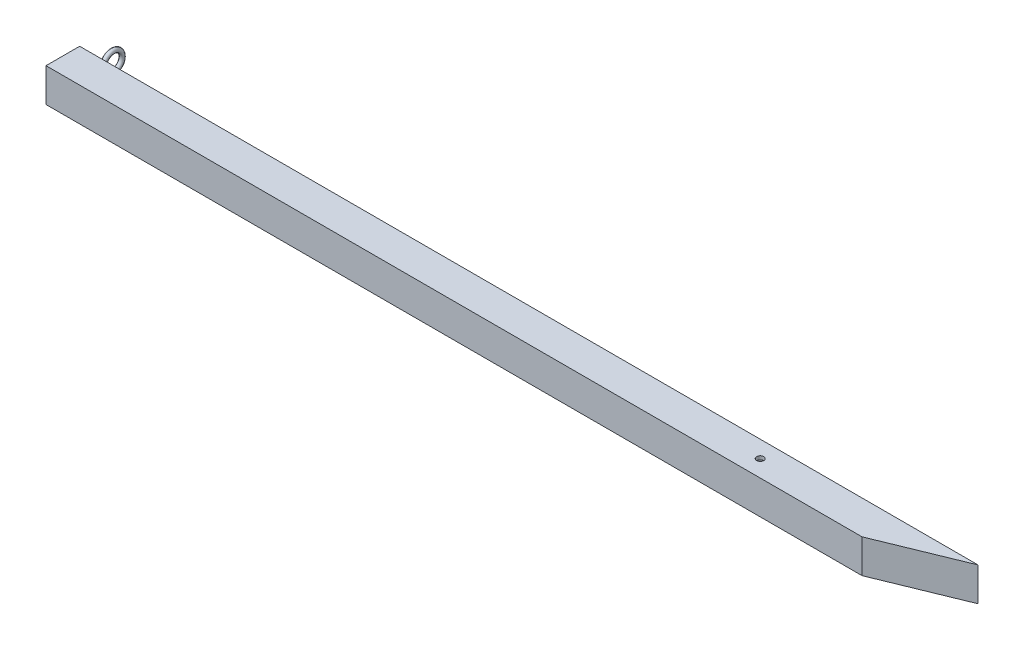
ISO-10303-21;
HEADER;
FILE_DESCRIPTION(('STEP AP214'),'2;1');
FILE_NAME('part.step','',(''),(''),'','','');
FILE_SCHEMA(('AUTOMOTIVE_DESIGN { 1 0 10303 214 1 1 1 1 }'));
ENDSEC;
DATA;
#1=APPLICATION_CONTEXT('core data for automotive mechanical design processes');
#2=APPLICATION_PROTOCOL_DEFINITION('international standard','automotive_design',2000,#1);
#3=PRODUCT_CONTEXT('',#1,'mechanical');
#4=PRODUCT('Part','Part','',(#3));
#5=PRODUCT_RELATED_PRODUCT_CATEGORY('part','',(#4));
#6=PRODUCT_DEFINITION_FORMATION('','',#4);
#7=PRODUCT_DEFINITION_CONTEXT('part definition',#1,'design');
#8=PRODUCT_DEFINITION('design','',#6,#7);
#9=PRODUCT_DEFINITION_SHAPE('','',#8);
#10=(LENGTH_UNIT() NAMED_UNIT(*) SI_UNIT(.MILLI.,.METRE.));
#11=(NAMED_UNIT(*) PLANE_ANGLE_UNIT() SI_UNIT($,.RADIAN.));
#12=(NAMED_UNIT(*) SI_UNIT($,.STERADIAN.) SOLID_ANGLE_UNIT());
#13=UNCERTAINTY_MEASURE_WITH_UNIT(LENGTH_MEASURE(1.E-05),#10,'distance_accuracy_value','');
#14=(GEOMETRIC_REPRESENTATION_CONTEXT(3) GLOBAL_UNCERTAINTY_ASSIGNED_CONTEXT((#13)) GLOBAL_UNIT_ASSIGNED_CONTEXT((#10,
#11,#12)) REPRESENTATION_CONTEXT('',''));
#15=CARTESIAN_POINT('',(0.,0.,0.));
#16=DIRECTION('',(0.,0.,1.));
#17=DIRECTION('',(1.,0.,0.));
#18=AXIS2_PLACEMENT_3D('',#15,#16,#17);
#19=CARTESIAN_POINT('',(0.,19.,19.));
#20=DIRECTION('',(0.,0.,-1.));
#21=DIRECTION('',(0.,1.,0.));
#22=AXIS2_PLACEMENT_3D('',#19,#20,#21);
#23=PLANE('',#22);
#24=DIRECTION('',(0.,-1.,0.));
#25=VECTOR('',#24,1.);
#26=CARTESIAN_POINT('',(-1000.,19.,19.0000000000001));
#27=LINE('',#26,#25);
#28=CARTESIAN_POINT('',(-1000.,19.,19.0000000000001));
#29=VERTEX_POINT('',#28);
#30=CARTESIAN_POINT('',(-1000.,-19.,19.0000000000001));
#31=VERTEX_POINT('',#30);
#32=EDGE_CURVE('E213',#29,#31,#27,.T.);
#33=ORIENTED_EDGE('',*,*,#32,.T.);
#34=DIRECTION('',(-1.,0.,0.));
#35=VECTOR('',#34,1.);
#36=CARTESIAN_POINT('',(0.,-19.,19.));
#37=LINE('',#36,#35);
#38=CARTESIAN_POINT('',(-78.672157524254,-19.,19.));
#39=VERTEX_POINT('',#38);
#40=EDGE_CURVE('E217',#39,#31,#37,.T.);
#41=ORIENTED_EDGE('',*,*,#40,.F.);
#42=DIRECTION('',(0.,1.,0.));
#43=VECTOR('',#42,1.);
#44=CARTESIAN_POINT('',(-78.672157524254,-19.,19.));
#45=LINE('',#44,#43);
#46=CARTESIAN_POINT('',(-78.672157524254,19.,19.));
#47=VERTEX_POINT('',#46);
#48=EDGE_CURVE('E157',#39,#47,#45,.T.);
#49=ORIENTED_EDGE('',*,*,#48,.T.);
#50=DIRECTION('',(-1.,0.,0.));
#51=VECTOR('',#50,1.);
#52=CARTESIAN_POINT('',(0.,19.,19.));
#53=LINE('',#52,#51);
#54=EDGE_CURVE('E196',#47,#29,#53,.T.);
#55=ORIENTED_EDGE('',*,*,#54,.T.);
#56=EDGE_LOOP('',(#33,#41,#49,#55));
#57=FACE_BOUND('',#56,.T.);
#58=ADVANCED_FACE('F58',(#57),#23,.F.);
#59=CARTESIAN_POINT('',(0.,-19.,-19.));
#60=DIRECTION('',(0.,1.,0.));
#61=DIRECTION('',(0.,0.,1.));
#62=AXIS2_PLACEMENT_3D('',#59,#60,#61);
#63=PLANE('',#62);
#64=CARTESIAN_POINT('',(-212.63683242,-19.,0.));
#65=DIRECTION('',(0.,1.,0.));
#66=DIRECTION('',(0.,0.,1.));
#67=AXIS2_PLACEMENT_3D('',#64,#65,#66);
#68=CIRCLE('',#67,3.99999999999999);
#69=CARTESIAN_POINT('',(-212.63683242,-19.,4.00000000000002));
#70=VERTEX_POINT('',#69);
#71=EDGE_CURVE('E180',#70,#70,#68,.T.);
#72=ORIENTED_EDGE('',*,*,#71,.T.);
#73=EDGE_LOOP('',(#72));
#74=FACE_BOUND('',#73,.T.);
#75=DIRECTION('',(0.,0.,-1.));
#76=VECTOR('',#75,1.);
#77=CARTESIAN_POINT('',(-1000.,-19.,-18.9999999999999));
#78=LINE('',#77,#76);
#79=CARTESIAN_POINT('',(-1000.,-19.,-18.9999999999999));
#80=VERTEX_POINT('',#79);
#81=EDGE_CURVE('E220',#31,#80,#78,.T.);
#82=ORIENTED_EDGE('',*,*,#81,.T.);
#83=DIRECTION('',(-1.,0.,0.));
#84=VECTOR('',#83,1.);
#85=CARTESIAN_POINT('',(0.,-19.,-19.));
#86=LINE('',#85,#84);
#87=CARTESIAN_POINT('',(14.258492684254,-19.,-19.));
#88=VERTEX_POINT('',#87);
#89=EDGE_CURVE('E226',#88,#80,#86,.T.);
#90=ORIENTED_EDGE('',*,*,#89,.F.);
#91=DIRECTION('',(-0.925606576571254,0.,0.378487074294542));
#92=VECTOR('',#91,1.);
#93=CARTESIAN_POINT('',(-78.672157524254,-19.,19.));
#94=LINE('',#93,#92);
#95=EDGE_CURVE('E150',#88,#39,#94,.T.);
#96=ORIENTED_EDGE('',*,*,#95,.T.);
#97=ORIENTED_EDGE('',*,*,#40,.T.);
#98=EDGE_LOOP('',(#82,#90,#96,#97));
#99=FACE_BOUND('',#98,.T.);
#100=ADVANCED_FACE('F256',(#74,#99),#63,.F.);
#101=CARTESIAN_POINT('',(0.,19.,-19.));
#102=DIRECTION('',(0.,0.,1.));
#103=DIRECTION('',(0.,-1.,0.));
#104=AXIS2_PLACEMENT_3D('',#101,#102,#103);
#105=PLANE('',#104);
#106=CARTESIAN_POINT('',(-985.,0.,-19.));
#107=DIRECTION('',(0.,0.,1.));
#108=DIRECTION('',(0.,-1.,0.));
#109=AXIS2_PLACEMENT_3D('',#106,#107,#108);
#110=CIRCLE('',#109,2.49999999999995);
#111=CARTESIAN_POINT('',(-985.,-2.49999999999996,-19.));
#112=VERTEX_POINT('',#111);
#113=EDGE_CURVE('E161',#112,#112,#110,.T.);
#114=ORIENTED_EDGE('',*,*,#113,.T.);
#115=EDGE_LOOP('',(#114));
#116=FACE_BOUND('',#115,.T.);
#117=DIRECTION('',(0.,1.,0.));
#118=VECTOR('',#117,1.);
#119=CARTESIAN_POINT('',(-1000.,19.,-18.9999999999999));
#120=LINE('',#119,#118);
#121=CARTESIAN_POINT('',(-1000.,19.,-18.9999999999999));
#122=VERTEX_POINT('',#121);
#123=EDGE_CURVE('E229',#80,#122,#120,.T.);
#124=ORIENTED_EDGE('',*,*,#123,.T.);
#125=DIRECTION('',(-1.,0.,0.));
#126=VECTOR('',#125,1.);
#127=CARTESIAN_POINT('',(0.,19.,-19.));
#128=LINE('',#127,#126);
#129=CARTESIAN_POINT('',(14.258492684254,19.,-19.));
#130=VERTEX_POINT('',#129);
#131=EDGE_CURVE('E233',#130,#122,#128,.T.);
#132=ORIENTED_EDGE('',*,*,#131,.F.);
#133=DIRECTION('',(0.,1.,0.));
#134=VECTOR('',#133,1.);
#135=CARTESIAN_POINT('',(14.258492684254,-19.,-19.));
#136=LINE('',#135,#134);
#137=EDGE_CURVE('E154',#88,#130,#136,.T.);
#138=ORIENTED_EDGE('',*,*,#137,.F.);
#139=ORIENTED_EDGE('',*,*,#89,.T.);
#140=EDGE_LOOP('',(#124,#132,#138,#139));
#141=FACE_BOUND('',#140,.T.);
#142=ADVANCED_FACE('F263',(#116,#141),#105,.F.);
#143=CARTESIAN_POINT('',(0.,19.,-19.));
#144=DIRECTION('',(0.,-1.,0.));
#145=DIRECTION('',(0.,0.,-1.));
#146=AXIS2_PLACEMENT_3D('',#143,#144,#145);
#147=PLANE('',#146);
#148=CARTESIAN_POINT('',(-212.63683242,19.,0.));
#149=DIRECTION('',(0.,1.,0.));
#150=DIRECTION('',(0.,0.,1.));
#151=AXIS2_PLACEMENT_3D('',#148,#149,#150);
#152=CIRCLE('',#151,3.99999999999999);
#153=CARTESIAN_POINT('',(-212.63683242,19.,4.00000000000002));
#154=VERTEX_POINT('',#153);
#155=EDGE_CURVE('E179',#154,#154,#152,.T.);
#156=ORIENTED_EDGE('',*,*,#155,.F.);
#157=EDGE_LOOP('',(#156));
#158=FACE_BOUND('',#157,.T.);
#159=DIRECTION('',(0.,0.,1.));
#160=VECTOR('',#159,1.);
#161=CARTESIAN_POINT('',(-1000.,19.,-18.9999999999999));
#162=LINE('',#161,#160);
#163=EDGE_CURVE('E67',#122,#29,#162,.T.);
#164=ORIENTED_EDGE('',*,*,#163,.T.);
#165=ORIENTED_EDGE('',*,*,#54,.F.);
#166=DIRECTION('',(-0.925606576571254,0.,0.378487074294542));
#167=VECTOR('',#166,1.);
#168=CARTESIAN_POINT('',(-78.672157524254,19.,19.));
#169=LINE('',#168,#167);
#170=EDGE_CURVE('E142',#130,#47,#169,.T.);
#171=ORIENTED_EDGE('',*,*,#170,.F.);
#172=ORIENTED_EDGE('',*,*,#131,.T.);
#173=EDGE_LOOP('',(#164,#165,#171,#172));
#174=FACE_BOUND('',#173,.T.);
#175=ADVANCED_FACE('F269',(#158,#174),#147,.F.);
#176=CARTESIAN_POINT('',(5.0000000000001,15.,-15.));
#177=DIRECTION('',(0.,-1.,0.));
#178=DIRECTION('',(0.,0.,-1.));
#179=AXIS2_PLACEMENT_3D('',#176,#177,#178);
#180=PLANE('',#179);
#181=DIRECTION('',(0.925606576571255,0.,-0.378487074294542));
#182=VECTOR('',#181,1.);
#183=CARTESIAN_POINT('',(3.41103310534666,15.,-18.8858875442089));
#184=LINE('',#183,#182);
#185=CARTESIAN_POINT('',(-79.4583764308564,15.,15.));
#186=VERTEX_POINT('',#185);
#187=CARTESIAN_POINT('',(-6.09207363466579,15.,-15.));
#188=VERTEX_POINT('',#187);
#189=EDGE_CURVE('E136',#186,#188,#184,.T.);
#190=ORIENTED_EDGE('',*,*,#189,.F.);
#191=DIRECTION('',(-1.,0.,0.));
#192=VECTOR('',#191,1.);
#193=CARTESIAN_POINT('',(5.0000000000001,15.,15.));
#194=LINE('',#193,#192);
#195=CARTESIAN_POINT('',(-1000.,15.,15.0000000000001));
#196=VERTEX_POINT('',#195);
#197=EDGE_CURVE('E124',#186,#196,#194,.T.);
#198=ORIENTED_EDGE('',*,*,#197,.T.);
#199=DIRECTION('',(0.,0.,-1.));
#200=VECTOR('',#199,1.);
#201=CARTESIAN_POINT('',(-1000.,15.,-15.));
#202=LINE('',#201,#200);
#203=CARTESIAN_POINT('',(-1000.,15.,-14.9999999999999));
#204=VERTEX_POINT('',#203);
#205=EDGE_CURVE('E201',#196,#204,#202,.T.);
#206=ORIENTED_EDGE('',*,*,#205,.T.);
#207=DIRECTION('',(-1.,0.,0.));
#208=VECTOR('',#207,1.);
#209=CARTESIAN_POINT('',(5.0000000000001,15.,-15.));
#210=LINE('',#209,#208);
#211=EDGE_CURVE('E139',#188,#204,#210,.T.);
#212=ORIENTED_EDGE('',*,*,#211,.F.);
#213=EDGE_LOOP('',(#190,#198,#206,#212));
#214=FACE_BOUND('',#213,.T.);
#215=CARTESIAN_POINT('',(-212.63683242,15.,0.));
#216=DIRECTION('',(0.,-1.,0.));
#217=DIRECTION('',(0.,0.,-1.));
#218=AXIS2_PLACEMENT_3D('',#215,#216,#217);
#219=CIRCLE('',#218,3.99999999999999);
#220=CARTESIAN_POINT('',(-212.63683242,15.,-3.99999999999996));
#221=VERTEX_POINT('',#220);
#222=EDGE_CURVE('E188',#221,#221,#219,.T.);
#223=ORIENTED_EDGE('',*,*,#222,.F.);
#224=EDGE_LOOP('',(#223));
#225=FACE_BOUND('',#224,.T.);
#226=ADVANCED_FACE('F137',(#214,#225),#180,.T.);
#227=CARTESIAN_POINT('',(5.0000000000001,15.,-15.));
#228=DIRECTION('',(0.,0.,1.));
#229=DIRECTION('',(1.,0.,0.));
#230=AXIS2_PLACEMENT_3D('',#227,#228,#229);
#231=PLANE('',#230);
#232=DIRECTION('',(0.,-1.,0.));
#233=VECTOR('',#232,1.);
#234=CARTESIAN_POINT('',(-6.09207363466579,15.,-15.));
#235=LINE('',#234,#233);
#236=CARTESIAN_POINT('',(-6.09207363466579,-15.,-15.));
#237=VERTEX_POINT('',#236);
#238=EDGE_CURVE('E74',#188,#237,#235,.T.);
#239=ORIENTED_EDGE('',*,*,#238,.F.);
#240=ORIENTED_EDGE('',*,*,#211,.T.);
#241=DIRECTION('',(0.,-1.,0.));
#242=VECTOR('',#241,1.);
#243=CARTESIAN_POINT('',(-1000.,15.,-14.9999999999999));
#244=LINE('',#243,#242);
#245=CARTESIAN_POINT('',(-1000.,-15.,-14.9999999999999));
#246=VERTEX_POINT('',#245);
#247=EDGE_CURVE('E197',#204,#246,#244,.T.);
#248=ORIENTED_EDGE('',*,*,#247,.T.);
#249=DIRECTION('',(-1.,0.,0.));
#250=VECTOR('',#249,1.);
#251=CARTESIAN_POINT('',(5.0000000000001,-15.,-15.));
#252=LINE('',#251,#250);
#253=EDGE_CURVE('E208',#237,#246,#252,.T.);
#254=ORIENTED_EDGE('',*,*,#253,.F.);
#255=EDGE_LOOP('',(#239,#240,#248,#254));
#256=FACE_BOUND('',#255,.T.);
#257=ADVANCED_FACE('F247',(#256),#231,.T.);
#258=CARTESIAN_POINT('',(5.0000000000001,-15.,-15.));
#259=DIRECTION('',(0.,1.,0.));
#260=DIRECTION('',(0.,0.,1.));
#261=AXIS2_PLACEMENT_3D('',#258,#259,#260);
#262=PLANE('',#261);
#263=DIRECTION('',(-0.925606576571255,0.,0.378487074294542));
#264=VECTOR('',#263,1.);
#265=CARTESIAN_POINT('',(3.41103310534666,-15.,-18.8858875442089));
#266=LINE('',#265,#264);
#267=CARTESIAN_POINT('',(-79.4583764308564,-15.,15.));
#268=VERTEX_POINT('',#267);
#269=EDGE_CURVE('E82',#237,#268,#266,.T.);
#270=ORIENTED_EDGE('',*,*,#269,.F.);
#271=ORIENTED_EDGE('',*,*,#253,.T.);
#272=DIRECTION('',(0.,0.,1.));
#273=VECTOR('',#272,1.);
#274=CARTESIAN_POINT('',(-1000.,-15.,-15.));
#275=LINE('',#274,#273);
#276=CARTESIAN_POINT('',(-1000.,-15.,15.0000000000001));
#277=VERTEX_POINT('',#276);
#278=EDGE_CURVE('E192',#246,#277,#275,.T.);
#279=ORIENTED_EDGE('',*,*,#278,.T.);
#280=DIRECTION('',(-1.,0.,0.));
#281=VECTOR('',#280,1.);
#282=CARTESIAN_POINT('',(5.0000000000001,-15.,15.));
#283=LINE('',#282,#281);
#284=EDGE_CURVE('E133',#268,#277,#283,.T.);
#285=ORIENTED_EDGE('',*,*,#284,.F.);
#286=EDGE_LOOP('',(#270,#271,#279,#285));
#287=FACE_BOUND('',#286,.T.);
#288=CARTESIAN_POINT('',(-212.63683242,-15.,0.));
#289=DIRECTION('',(0.,1.,0.));
#290=DIRECTION('',(0.,0.,1.));
#291=AXIS2_PLACEMENT_3D('',#288,#289,#290);
#292=CIRCLE('',#291,3.99999999999999);
#293=CARTESIAN_POINT('',(-212.63683242,-15.,4.00000000000002));
#294=VERTEX_POINT('',#293);
#295=EDGE_CURVE('E184',#294,#294,#292,.T.);
#296=ORIENTED_EDGE('',*,*,#295,.F.);
#297=EDGE_LOOP('',(#296));
#298=FACE_BOUND('',#297,.T.);
#299=ADVANCED_FACE('F245',(#287,#298),#262,.T.);
#300=CARTESIAN_POINT('',(5.0000000000001,15.,15.));
#301=DIRECTION('',(0.,0.,-1.));
#302=DIRECTION('',(-1.,0.,0.));
#303=AXIS2_PLACEMENT_3D('',#300,#301,#302);
#304=PLANE('',#303);
#305=DIRECTION('',(0.,1.,0.));
#306=VECTOR('',#305,1.);
#307=CARTESIAN_POINT('',(-79.4583764308564,15.,15.));
#308=LINE('',#307,#306);
#309=EDGE_CURVE('E12',#268,#186,#308,.T.);
#310=ORIENTED_EDGE('',*,*,#309,.F.);
#311=ORIENTED_EDGE('',*,*,#284,.T.);
#312=DIRECTION('',(0.,1.,0.));
#313=VECTOR('',#312,1.);
#314=CARTESIAN_POINT('',(-1000.,15.,15.0000000000001));
#315=LINE('',#314,#313);
#316=EDGE_CURVE('E128',#277,#196,#315,.T.);
#317=ORIENTED_EDGE('',*,*,#316,.T.);
#318=ORIENTED_EDGE('',*,*,#197,.F.);
#319=EDGE_LOOP('',(#310,#311,#317,#318));
#320=FACE_BOUND('',#319,.T.);
#321=ADVANCED_FACE('F126',(#320),#304,.T.);
#322=CARTESIAN_POINT('',(-1000.,0.,1.22464679914735E-13));
#323=DIRECTION('',(-1.,0.,0.));
#324=DIRECTION('',(0.,0.,1.));
#325=AXIS2_PLACEMENT_3D('',#322,#323,#324);
#326=PLANE('',#325);
#327=ORIENTED_EDGE('',*,*,#32,.F.);
#328=ORIENTED_EDGE('',*,*,#163,.F.);
#329=ORIENTED_EDGE('',*,*,#123,.F.);
#330=ORIENTED_EDGE('',*,*,#81,.F.);
#331=EDGE_LOOP('',(#327,#328,#329,#330));
#332=FACE_BOUND('',#331,.T.);
#333=ORIENTED_EDGE('',*,*,#247,.F.);
#334=ORIENTED_EDGE('',*,*,#205,.F.);
#335=ORIENTED_EDGE('',*,*,#316,.F.);
#336=ORIENTED_EDGE('',*,*,#278,.F.);
#337=EDGE_LOOP('',(#333,#334,#335,#336));
#338=FACE_BOUND('',#337,.T.);
#339=ADVANCED_FACE('F60',(#332,#338),#326,.T.);
#340=CARTESIAN_POINT('',(-212.63683242,-19.,0.));
#341=DIRECTION('',(0.,1.,0.));
#342=DIRECTION('',(0.,0.,1.));
#343=AXIS2_PLACEMENT_3D('',#340,#341,#342);
#344=CYLINDRICAL_SURFACE('',#343,3.99999999999999);
#345=ORIENTED_EDGE('',*,*,#295,.T.);
#346=EDGE_LOOP('',(#345));
#347=FACE_BOUND('',#346,.T.);
#348=ORIENTED_EDGE('',*,*,#71,.F.);
#349=EDGE_LOOP('',(#348));
#350=FACE_BOUND('',#349,.T.);
#351=ADVANCED_FACE('F242',(#347,#350),#344,.F.);
#352=ORIENTED_EDGE('',*,*,#222,.T.);
#353=EDGE_LOOP('',(#352));
#354=FACE_BOUND('',#353,.T.);
#355=ORIENTED_EDGE('',*,*,#155,.T.);
#356=EDGE_LOOP('',(#355));
#357=FACE_BOUND('',#356,.T.);
#358=ADVANCED_FACE('F305',(#354,#357),#344,.F.);
#359=CARTESIAN_POINT('',(-985.,-3.16866893852641,-31.3212637978578));
#360=DIRECTION('',(0.,-0.950063394598164,-0.312056959936186));
#361=DIRECTION('',(0.,0.312056959936186,-0.950063394598164));
#362=AXIS2_PLACEMENT_3D('',#359,#360,#361);
#363=PLANE('',#362);
#364=CARTESIAN_POINT('',(-985.,-3.16866893852641,-31.3212637978578));
#365=DIRECTION('',(0.,-0.950063394598164,-0.312056959936186));
#366=DIRECTION('',(0.,0.312056959936186,-0.950063394598164));
#367=AXIS2_PLACEMENT_3D('',#364,#365,#366);
#368=CIRCLE('',#367,2.49999999999995);
#369=CARTESIAN_POINT('',(-985.,-2.38852653868596,-33.6964222843532));
#370=VERTEX_POINT('',#369);
#371=EDGE_CURVE('E175',#370,#370,#368,.T.);
#372=ORIENTED_EDGE('',*,*,#371,.F.);
#373=EDGE_LOOP('',(#372));
#374=FACE_BOUND('',#373,.T.);
#375=ADVANCED_FACE('F297',(#374),#363,.F.);
#376=CARTESIAN_POINT('',(-985.,0.,-19.));
#377=DIRECTION('',(0.,0.,-1.));
#378=DIRECTION('',(0.,1.,0.));
#379=AXIS2_PLACEMENT_3D('',#376,#377,#378);
#380=CYLINDRICAL_SURFACE('',#379,2.49999999999995);
#381=CARTESIAN_POINT('',(-985.,0.,-26.570946824867));
#382=DIRECTION('',(0.,0.,1.));
#383=DIRECTION('',(0.,-1.,0.));
#384=AXIS2_PLACEMENT_3D('',#381,#382,#383);
#385=CIRCLE('',#384,2.49999999999995);
#386=CARTESIAN_POINT('',(-985.,-2.49999999999995,-26.570946824867));
#387=VERTEX_POINT('',#386);
#388=EDGE_CURVE('E167',#387,#387,#385,.T.);
#389=ORIENTED_EDGE('',*,*,#388,.T.);
#390=EDGE_LOOP('',(#389));
#391=FACE_BOUND('',#390,.T.);
#392=ORIENTED_EDGE('',*,*,#113,.F.);
#393=EDGE_LOOP('',(#392));
#394=FACE_BOUND('',#393,.T.);
#395=ADVANCED_FACE('F308',(#391,#394),#380,.T.);
#396=CARTESIAN_POINT('',(-985.,5.,-26.570946824867));
#397=DIRECTION('',(1.,0.,0.));
#398=DIRECTION('',(0.,0.,-1.));
#399=AXIS2_PLACEMENT_3D('',#396,#397,#398);
#400=TOROIDAL_SURFACE('',#399,5.,2.49999999999995);
#401=CARTESIAN_POINT('',(-985.,3.43971520031906,-31.3212637978578));
#402=DIRECTION('',(0.,-0.950063394598164,0.312056959936186));
#403=DIRECTION('',(0.,-0.312056959936186,-0.950063394598164));
#404=AXIS2_PLACEMENT_3D('',#401,#402,#403);
#405=CIRCLE('',#404,2.49999999999995);
#406=CARTESIAN_POINT('',(-985.,2.65957280047861,-33.6964222843532));
#407=VERTEX_POINT('',#406);
#408=EDGE_CURVE('E171',#407,#407,#405,.T.);
#409=CARTESIAN_POINT('',(-985.,5.,-26.570946824867));
#410=DIRECTION('',(1.,0.,0.));
#411=DIRECTION('',(0.,0.,-1.));
#412=AXIS2_PLACEMENT_3D('',#409,#410,#411);
#413=CIRCLE('',#412,7.49999999999995);
#414=EDGE_CURVE('',#387,#407,#413,.T.);
#415=ORIENTED_EDGE('',*,*,#388,.F.);
#416=ORIENTED_EDGE('',*,*,#408,.T.);
#417=ORIENTED_EDGE('',*,*,#414,.T.);
#418=ORIENTED_EDGE('',*,*,#414,.F.);
#419=EDGE_LOOP('',(#415,#417,#416,#418));
#420=FACE_BOUND('',#419,.T.);
#421=ADVANCED_FACE('F302',(#420),#400,.T.);
#422=CARTESIAN_POINT('',(-985.,0.13552313089633,-41.3809398727707));
#423=DIRECTION('',(-1.,0.,0.));
#424=DIRECTION('',(0.,0.,1.));
#425=AXIS2_PLACEMENT_3D('',#422,#423,#424);
#426=TOROIDAL_SURFACE('',#425,10.588426132519,2.49999999999995);
#427=ORIENTED_EDGE('',*,*,#371,.T.);
#428=EDGE_LOOP('',(#427));
#429=FACE_BOUND('',#428,.T.);
#430=ORIENTED_EDGE('',*,*,#408,.F.);
#431=EDGE_LOOP('',(#430));
#432=FACE_BOUND('',#431,.T.);
#433=ADVANCED_FACE('F295',(#429,#432),#426,.T.);
#434=CARTESIAN_POINT('',(-78.672157524254,-19.,19.));
#435=DIRECTION('',(-0.378487074294542,0.,-0.925606576571254));
#436=DIRECTION('',(-0.925606576571255,0.,0.378487074294542));
#437=AXIS2_PLACEMENT_3D('',#434,#435,#436);
#438=PLANE('',#437);
#439=ORIENTED_EDGE('',*,*,#170,.T.);
#440=ORIENTED_EDGE('',*,*,#48,.F.);
#441=ORIENTED_EDGE('',*,*,#95,.F.);
#442=ORIENTED_EDGE('',*,*,#137,.T.);
#443=EDGE_LOOP('',(#439,#440,#441,#442));
#444=FACE_BOUND('',#443,.T.);
#445=ADVANCED_FACE('F289',(#444),#438,.F.);
#446=CARTESIAN_POINT('',(3.6901000714929,-19.,-19.));
#447=DIRECTION('',(-0.378487074294542,0.,-0.925606576571255));
#448=DIRECTION('',(-0.925606576571255,0.,0.378487074294542));
#449=AXIS2_PLACEMENT_3D('',#446,#447,#448);
#450=PLANE('',#449);
#451=ORIENTED_EDGE('',*,*,#309,.T.);
#452=ORIENTED_EDGE('',*,*,#189,.T.);
#453=ORIENTED_EDGE('',*,*,#238,.T.);
#454=ORIENTED_EDGE('',*,*,#269,.T.);
#455=EDGE_LOOP('',(#451,#452,#453,#454));
#456=FACE_BOUND('',#455,.T.);
#457=ADVANCED_FACE('F144',(#456),#450,.T.);
#458=CLOSED_SHELL('',(#58,#100,#142,#175,#226,#257,#299,#321,#339,#351,#358,#375,#395,#421,#433,
#445,#457));
#459=MANIFOLD_SOLID_BREP('B2',#458);
#460=ADVANCED_BREP_SHAPE_REPRESENTATION('',(#18,#459),#14);
#461=SHAPE_DEFINITION_REPRESENTATION(#9,#460);
ENDSEC;
END-ISO-10303-21;
